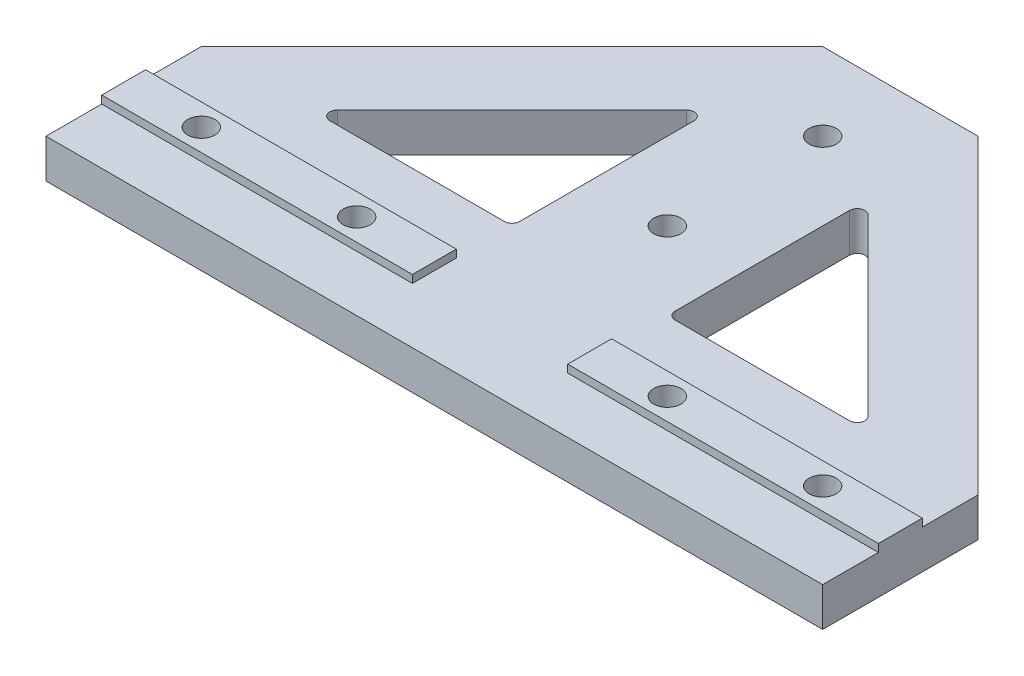
ISO-10303-21;
HEADER;
FILE_DESCRIPTION(('STEP AP214'),'2;1');
FILE_NAME('part.step','',(''),(''),'','','');
FILE_SCHEMA(('AUTOMOTIVE_DESIGN { 1 0 10303 214 1 1 1 1 }'));
ENDSEC;
DATA;
#1=APPLICATION_CONTEXT('core data for automotive mechanical design processes');
#2=APPLICATION_PROTOCOL_DEFINITION('international standard','automotive_design',2000,#1);
#3=PRODUCT_CONTEXT('',#1,'mechanical');
#4=PRODUCT('Part','Part','',(#3));
#5=PRODUCT_RELATED_PRODUCT_CATEGORY('part','',(#4));
#6=PRODUCT_DEFINITION_FORMATION('','',#4);
#7=PRODUCT_DEFINITION_CONTEXT('part definition',#1,'design');
#8=PRODUCT_DEFINITION('design','',#6,#7);
#9=PRODUCT_DEFINITION_SHAPE('','',#8);
#10=(LENGTH_UNIT() NAMED_UNIT(*) SI_UNIT(.MILLI.,.METRE.));
#11=(NAMED_UNIT(*) PLANE_ANGLE_UNIT() SI_UNIT($,.RADIAN.));
#12=(NAMED_UNIT(*) SI_UNIT($,.STERADIAN.) SOLID_ANGLE_UNIT());
#13=UNCERTAINTY_MEASURE_WITH_UNIT(LENGTH_MEASURE(1.E-05),#10,'distance_accuracy_value','');
#14=(GEOMETRIC_REPRESENTATION_CONTEXT(3) GLOBAL_UNCERTAINTY_ASSIGNED_CONTEXT((#13)) GLOBAL_UNIT_ASSIGNED_CONTEXT((#10,
#11,#12)) REPRESENTATION_CONTEXT('',''));
#15=CARTESIAN_POINT('',(0.,0.,0.));
#16=DIRECTION('',(0.,0.,1.));
#17=DIRECTION('',(1.,0.,0.));
#18=AXIS2_PLACEMENT_3D('',#15,#16,#17);
#19=CARTESIAN_POINT('',(0.,5.,0.));
#20=DIRECTION('',(0.,-1.,0.));
#21=DIRECTION('',(0.,0.,-1.));
#22=AXIS2_PLACEMENT_3D('',#19,#20,#21);
#23=PLANE('',#22);
#24=CARTESIAN_POINT('',(11.,5.,-43.4436507823299));
#25=DIRECTION('',(0.,1.,0.));
#26=DIRECTION('',(0.,0.,1.));
#27=AXIS2_PLACEMENT_3D('',#24,#25,#26);
#28=CIRCLE('',#27,1.);
#29=CARTESIAN_POINT('',(11.70710675051,5.,-44.150757594193));
#30=VERTEX_POINT('',#29);
#31=CARTESIAN_POINT('',(10.,5.,-43.4436507823299));
#32=VERTEX_POINT('',#31);
#33=EDGE_CURVE('E272',#30,#32,#28,.T.);
#34=ORIENTED_EDGE('',*,*,#33,.F.);
#35=DIRECTION('',(-0.707106811863124,0.,-0.70710675050997));
#36=VECTOR('',#35,1.);
#37=CARTESIAN_POINT('',(11.70710675051,5.,-44.150757594193));
#38=LINE('',#37,#36);
#39=CARTESIAN_POINT('',(34.1507581414754,5.,-21.7071081505837));
#40=VERTEX_POINT('',#39);
#41=EDGE_CURVE('E284',#40,#30,#38,.T.);
#42=ORIENTED_EDGE('',*,*,#41,.F.);
#43=CARTESIAN_POINT('',(33.4436513909654,5.,-21.0000013387206));
#44=DIRECTION('',(0.,1.,0.));
#45=DIRECTION('',(0.,0.,1.));
#46=AXIS2_PLACEMENT_3D('',#43,#44,#45);
#47=CIRCLE('',#46,1.);
#48=CARTESIAN_POINT('',(33.4436513909654,5.,-20.0000013387206));
#49=VERTEX_POINT('',#48);
#50=EDGE_CURVE('E281',#49,#40,#47,.T.);
#51=ORIENTED_EDGE('',*,*,#50,.F.);
#52=DIRECTION('',(1.,0.,0.));
#53=VECTOR('',#52,1.);
#54=CARTESIAN_POINT('',(33.4436513909654,5.,-20.0000013387206));
#55=LINE('',#54,#53);
#56=CARTESIAN_POINT('',(11.,5.,-20.0000013387206));
#57=VERTEX_POINT('',#56);
#58=EDGE_CURVE('E279',#57,#49,#55,.T.);
#59=ORIENTED_EDGE('',*,*,#58,.F.);
#60=CARTESIAN_POINT('',(11.,5.,-21.0000013387206));
#61=DIRECTION('',(0.,1.,0.));
#62=DIRECTION('',(0.,0.,1.));
#63=AXIS2_PLACEMENT_3D('',#60,#61,#62);
#64=CIRCLE('',#63,0.999999999999999);
#65=CARTESIAN_POINT('',(10.,5.,-21.0000013387206));
#66=VERTEX_POINT('',#65);
#67=EDGE_CURVE('E277',#66,#57,#64,.T.);
#68=ORIENTED_EDGE('',*,*,#67,.F.);
#69=DIRECTION('',(0.,0.,1.));
#70=VECTOR('',#69,1.);
#71=CARTESIAN_POINT('',(10.,5.,-43.4436507823299));
#72=LINE('',#71,#70);
#73=EDGE_CURVE('E274',#32,#66,#72,.T.);
#74=ORIENTED_EDGE('',*,*,#73,.F.);
#75=EDGE_LOOP('',(#34,#42,#51,#59,#68,#74));
#76=FACE_BOUND('',#75,.T.);
#77=CARTESIAN_POINT('',(-11.,5.,-21.0000013387206));
#78=DIRECTION('',(0.,1.,0.));
#79=DIRECTION('',(0.,0.,-1.));
#80=AXIS2_PLACEMENT_3D('',#77,#78,#79);
#81=CIRCLE('',#80,0.999999999999999);
#82=CARTESIAN_POINT('',(-11.,5.,-20.0000013387206));
#83=VERTEX_POINT('',#82);
#84=CARTESIAN_POINT('',(-10.,5.,-21.0000013387206));
#85=VERTEX_POINT('',#84);
#86=EDGE_CURVE('E341',#83,#85,#81,.T.);
#87=ORIENTED_EDGE('',*,*,#86,.F.);
#88=DIRECTION('',(1.,0.,0.));
#89=VECTOR('',#88,1.);
#90=CARTESIAN_POINT('',(-33.4436513909654,5.,-20.0000013387205));
#91=LINE('',#90,#89);
#92=CARTESIAN_POINT('',(-33.4436513909654,5.,-20.0000013387205));
#93=VERTEX_POINT('',#92);
#94=EDGE_CURVE('E353',#93,#83,#91,.T.);
#95=ORIENTED_EDGE('',*,*,#94,.F.);
#96=CARTESIAN_POINT('',(-33.4436513909654,5.,-21.0000013387205));
#97=DIRECTION('',(0.,1.,0.));
#98=DIRECTION('',(0.,0.,-1.));
#99=AXIS2_PLACEMENT_3D('',#96,#97,#98);
#100=CIRCLE('',#99,1.);
#101=CARTESIAN_POINT('',(-34.1507581414754,5.,-21.7071081505837));
#102=VERTEX_POINT('',#101);
#103=EDGE_CURVE('E350',#102,#93,#100,.T.);
#104=ORIENTED_EDGE('',*,*,#103,.F.);
#105=DIRECTION('',(-0.707106811863124,0.,0.70710675050997));
#106=VECTOR('',#105,1.);
#107=CARTESIAN_POINT('',(-11.70710675051,5.,-44.150757594193));
#108=LINE('',#107,#106);
#109=CARTESIAN_POINT('',(-11.70710675051,5.,-44.150757594193));
#110=VERTEX_POINT('',#109);
#111=EDGE_CURVE('E348',#110,#102,#108,.T.);
#112=ORIENTED_EDGE('',*,*,#111,.F.);
#113=CARTESIAN_POINT('',(-11.,5.,-43.4436507823298));
#114=DIRECTION('',(0.,1.,0.));
#115=DIRECTION('',(0.,0.,-1.));
#116=AXIS2_PLACEMENT_3D('',#113,#114,#115);
#117=CIRCLE('',#116,1.);
#118=CARTESIAN_POINT('',(-10.,5.,-43.4436507823298));
#119=VERTEX_POINT('',#118);
#120=EDGE_CURVE('E346',#119,#110,#117,.T.);
#121=ORIENTED_EDGE('',*,*,#120,.F.);
#122=DIRECTION('',(0.,0.,-1.));
#123=VECTOR('',#122,1.);
#124=CARTESIAN_POINT('',(-10.,5.,-43.4436507823298));
#125=LINE('',#124,#123);
#126=EDGE_CURVE('E343',#85,#119,#125,.T.);
#127=ORIENTED_EDGE('',*,*,#126,.F.);
#128=EDGE_LOOP('',(#87,#95,#104,#112,#121,#127));
#129=FACE_BOUND('',#128,.T.);
#130=CARTESIAN_POINT('',(0.,5.,-50.0000025455212));
#131=DIRECTION('',(0.,1.,0.));
#132=DIRECTION('',(0.,0.,1.));
#133=AXIS2_PLACEMENT_3D('',#130,#131,#132);
#134=CIRCLE('',#133,1.75);
#135=CARTESIAN_POINT('',(0.,5.,-48.2500025455212));
#136=VERTEX_POINT('',#135);
#137=EDGE_CURVE('E329',#136,#136,#134,.T.);
#138=ORIENTED_EDGE('',*,*,#137,.F.);
#139=EDGE_LOOP('',(#138));
#140=FACE_BOUND('',#139,.T.);
#141=CARTESIAN_POINT('',(0.,5.,-30.0000025455212));
#142=DIRECTION('',(0.,1.,0.));
#143=DIRECTION('',(0.,0.,1.));
#144=AXIS2_PLACEMENT_3D('',#141,#142,#143);
#145=CIRCLE('',#144,1.75);
#146=CARTESIAN_POINT('',(0.,5.,-28.2500025455212));
#147=VERTEX_POINT('',#146);
#148=EDGE_CURVE('E317',#147,#147,#145,.T.);
#149=ORIENTED_EDGE('',*,*,#148,.F.);
#150=EDGE_LOOP('',(#149));
#151=FACE_BOUND('',#150,.T.);
#152=DIRECTION('',(1.,0.,0.));
#153=VECTOR('',#152,1.);
#154=CARTESIAN_POINT('',(0.,5.,-7.17500133872055));
#155=LINE('',#154,#153);
#156=CARTESIAN_POINT('',(10.,5.,-7.17500133872055));
#157=VERTEX_POINT('',#156);
#158=CARTESIAN_POINT('',(50.,5.,-7.17500133872055));
#159=VERTEX_POINT('',#158);
#160=EDGE_CURVE('E52',#157,#159,#155,.T.);
#161=ORIENTED_EDGE('',*,*,#160,.F.);
#162=DIRECTION('',(0.,0.,1.));
#163=VECTOR('',#162,1.);
#164=CARTESIAN_POINT('',(10.,5.,0.));
#165=LINE('',#164,#163);
#166=CARTESIAN_POINT('',(10.,5.,-12.8250013387206));
#167=VERTEX_POINT('',#166);
#168=EDGE_CURVE('E57',#167,#157,#165,.T.);
#169=ORIENTED_EDGE('',*,*,#168,.F.);
#170=DIRECTION('',(1.,0.,0.));
#171=VECTOR('',#170,1.);
#172=CARTESIAN_POINT('',(0.,5.,-12.8250013387206));
#173=LINE('',#172,#171);
#174=CARTESIAN_POINT('',(50.,5.,-12.8250013387206));
#175=VERTEX_POINT('',#174);
#176=EDGE_CURVE('E449',#167,#175,#173,.T.);
#177=ORIENTED_EDGE('',*,*,#176,.T.);
#178=DIRECTION('',(0.,0.,-1.));
#179=VECTOR('',#178,1.);
#180=CARTESIAN_POINT('',(50.,5.,-20.0000026774411));
#181=LINE('',#180,#179);
#182=CARTESIAN_POINT('',(50.,5.,-20.0000026774411));
#183=VERTEX_POINT('',#182);
#184=EDGE_CURVE('E389',#175,#183,#181,.T.);
#185=ORIENTED_EDGE('',*,*,#184,.T.);
#186=DIRECTION('',(-0.707106811863124,0.,-0.70710675050997));
#187=VECTOR('',#186,1.);
#188=CARTESIAN_POINT('',(9.99999666126133,5.,-60.0000025455212));
#189=LINE('',#188,#187);
#190=CARTESIAN_POINT('',(9.99999666126133,5.,-60.0000025455212));
#191=VERTEX_POINT('',#190);
#192=EDGE_CURVE('E393',#183,#191,#189,.T.);
#193=ORIENTED_EDGE('',*,*,#192,.T.);
#194=DIRECTION('',(-1.,0.,0.));
#195=VECTOR('',#194,1.);
#196=CARTESIAN_POINT('',(-9.99999666126133,5.,-60.0000025455212));
#197=LINE('',#196,#195);
#198=CARTESIAN_POINT('',(-9.99999666126133,5.,-60.0000025455212));
#199=VERTEX_POINT('',#198);
#200=EDGE_CURVE('E395',#191,#199,#197,.T.);
#201=ORIENTED_EDGE('',*,*,#200,.T.);
#202=DIRECTION('',(-0.707106811863124,0.,0.70710675050997));
#203=VECTOR('',#202,1.);
#204=CARTESIAN_POINT('',(-9.99999666126133,5.,-60.0000025455212));
#205=LINE('',#204,#203);
#206=CARTESIAN_POINT('',(-50.,5.,-20.0000026774411));
#207=VERTEX_POINT('',#206);
#208=EDGE_CURVE('E397',#199,#207,#205,.T.);
#209=ORIENTED_EDGE('',*,*,#208,.T.);
#210=DIRECTION('',(0.,0.,1.));
#211=VECTOR('',#210,1.);
#212=CARTESIAN_POINT('',(-50.,5.,0.));
#213=LINE('',#212,#211);
#214=CARTESIAN_POINT('',(-50.,5.,-12.8250013387205));
#215=VERTEX_POINT('',#214);
#216=EDGE_CURVE('E400',#207,#215,#213,.T.);
#217=ORIENTED_EDGE('',*,*,#216,.T.);
#218=DIRECTION('',(-1.,0.,0.));
#219=VECTOR('',#218,1.);
#220=CARTESIAN_POINT('',(0.,5.,-12.8250013387205));
#221=LINE('',#220,#219);
#222=CARTESIAN_POINT('',(-9.99999999999999,5.,-12.8250013387205));
#223=VERTEX_POINT('',#222);
#224=EDGE_CURVE('E233',#223,#215,#221,.T.);
#225=ORIENTED_EDGE('',*,*,#224,.F.);
#226=DIRECTION('',(0.,0.,-1.));
#227=VECTOR('',#226,1.);
#228=CARTESIAN_POINT('',(-9.99999999999999,5.,0.));
#229=LINE('',#228,#227);
#230=CARTESIAN_POINT('',(-9.99999999999999,5.,-7.17500133872054));
#231=VERTEX_POINT('',#230);
#232=EDGE_CURVE('E230',#231,#223,#229,.T.);
#233=ORIENTED_EDGE('',*,*,#232,.F.);
#234=DIRECTION('',(-1.,0.,0.));
#235=VECTOR('',#234,1.);
#236=CARTESIAN_POINT('',(0.,5.,-7.17500133872054));
#237=LINE('',#236,#235);
#238=CARTESIAN_POINT('',(-50.,5.,-7.17500133872054));
#239=VERTEX_POINT('',#238);
#240=EDGE_CURVE('E243',#231,#239,#237,.T.);
#241=ORIENTED_EDGE('',*,*,#240,.T.);
#242=CARTESIAN_POINT('',(-50.,5.,0.));
#243=VERTEX_POINT('',#242);
#244=EDGE_CURVE('E399',#239,#243,#213,.T.);
#245=ORIENTED_EDGE('',*,*,#244,.T.);
#246=DIRECTION('',(1.,0.,0.));
#247=VECTOR('',#246,1.);
#248=CARTESIAN_POINT('',(50.,5.,0.));
#249=LINE('',#248,#247);
#250=CARTESIAN_POINT('',(50.,5.,0.));
#251=VERTEX_POINT('',#250);
#252=EDGE_CURVE('E386',#243,#251,#249,.T.);
#253=ORIENTED_EDGE('',*,*,#252,.T.);
#254=EDGE_CURVE('E391',#251,#159,#181,.T.);
#255=ORIENTED_EDGE('',*,*,#254,.T.);
#256=EDGE_LOOP('',(#161,#169,#177,#185,#193,#201,#209,#217,#225,#233,#241,#245,#253,#255));
#257=FACE_BOUND('',#256,.T.);
#258=ADVANCED_FACE('F37',(#76,#129,#140,#151,#257),#23,.F.);
#259=CARTESIAN_POINT('',(0.,0.,0.));
#260=DIRECTION('',(0.,-1.,0.));
#261=DIRECTION('',(0.,0.,-1.));
#262=AXIS2_PLACEMENT_3D('',#259,#260,#261);
#263=PLANE('',#262);
#264=CARTESIAN_POINT('',(40.,0.,-10.0000013387206));
#265=DIRECTION('',(0.,1.,0.));
#266=DIRECTION('',(0.,0.,-1.));
#267=AXIS2_PLACEMENT_3D('',#264,#265,#266);
#268=CIRCLE('',#267,1.75);
#269=CARTESIAN_POINT('',(40.,0.,-11.7500013387206));
#270=VERTEX_POINT('',#269);
#271=EDGE_CURVE('E320',#270,#270,#268,.T.);
#272=ORIENTED_EDGE('',*,*,#271,.T.);
#273=EDGE_LOOP('',(#272));
#274=FACE_BOUND('',#273,.T.);
#275=CARTESIAN_POINT('',(0.,0.,-50.0000025455212));
#276=DIRECTION('',(0.,1.,0.));
#277=DIRECTION('',(0.,0.,1.));
#278=AXIS2_PLACEMENT_3D('',#275,#276,#277);
#279=CIRCLE('',#278,1.75);
#280=CARTESIAN_POINT('',(0.,0.,-48.2500025455212));
#281=VERTEX_POINT('',#280);
#282=EDGE_CURVE('E328',#281,#281,#279,.T.);
#283=ORIENTED_EDGE('',*,*,#282,.T.);
#284=EDGE_LOOP('',(#283));
#285=FACE_BOUND('',#284,.T.);
#286=CARTESIAN_POINT('',(-40.,0.,-10.0000013387205));
#287=DIRECTION('',(0.,1.,0.));
#288=DIRECTION('',(0.,0.,1.));
#289=AXIS2_PLACEMENT_3D('',#286,#287,#288);
#290=CIRCLE('',#289,1.75);
#291=CARTESIAN_POINT('',(-40.,0.,-8.25000133872054));
#292=VERTEX_POINT('',#291);
#293=EDGE_CURVE('E337',#292,#292,#290,.T.);
#294=ORIENTED_EDGE('',*,*,#293,.T.);
#295=EDGE_LOOP('',(#294));
#296=FACE_BOUND('',#295,.T.);
#297=DIRECTION('',(1.,0.,0.));
#298=VECTOR('',#297,1.);
#299=CARTESIAN_POINT('',(50.,0.,0.));
#300=LINE('',#299,#298);
#301=CARTESIAN_POINT('',(-50.,0.,0.));
#302=VERTEX_POINT('',#301);
#303=CARTESIAN_POINT('',(50.,0.,0.));
#304=VERTEX_POINT('',#303);
#305=EDGE_CURVE('E385',#302,#304,#300,.T.);
#306=ORIENTED_EDGE('',*,*,#305,.F.);
#307=DIRECTION('',(0.,0.,1.));
#308=VECTOR('',#307,1.);
#309=CARTESIAN_POINT('',(-50.,0.,0.));
#310=LINE('',#309,#308);
#311=CARTESIAN_POINT('',(-50.,0.,-20.0000026774411));
#312=VERTEX_POINT('',#311);
#313=EDGE_CURVE('E390',#312,#302,#310,.T.);
#314=ORIENTED_EDGE('',*,*,#313,.F.);
#315=DIRECTION('',(-0.707106811863124,0.,0.70710675050997));
#316=VECTOR('',#315,1.);
#317=CARTESIAN_POINT('',(-9.99999666126133,0.,-60.0000025455212));
#318=LINE('',#317,#316);
#319=CARTESIAN_POINT('',(-9.99999666126133,0.,-60.0000025455212));
#320=VERTEX_POINT('',#319);
#321=EDGE_CURVE('E411',#320,#312,#318,.T.);
#322=ORIENTED_EDGE('',*,*,#321,.F.);
#323=DIRECTION('',(-1.,0.,0.));
#324=VECTOR('',#323,1.);
#325=CARTESIAN_POINT('',(-9.99999666126133,0.,-60.0000025455212));
#326=LINE('',#325,#324);
#327=CARTESIAN_POINT('',(9.99999666126133,0.,-60.0000025455212));
#328=VERTEX_POINT('',#327);
#329=EDGE_CURVE('E409',#328,#320,#326,.T.);
#330=ORIENTED_EDGE('',*,*,#329,.F.);
#331=DIRECTION('',(-0.707106811863124,0.,-0.70710675050997));
#332=VECTOR('',#331,1.);
#333=CARTESIAN_POINT('',(9.99999666126133,0.,-60.0000025455212));
#334=LINE('',#333,#332);
#335=CARTESIAN_POINT('',(50.,0.,-20.0000026774411));
#336=VERTEX_POINT('',#335);
#337=EDGE_CURVE('E407',#336,#328,#334,.T.);
#338=ORIENTED_EDGE('',*,*,#337,.F.);
#339=DIRECTION('',(0.,0.,-1.));
#340=VECTOR('',#339,1.);
#341=CARTESIAN_POINT('',(50.,0.,-20.0000026774411));
#342=LINE('',#341,#340);
#343=EDGE_CURVE('E405',#304,#336,#342,.T.);
#344=ORIENTED_EDGE('',*,*,#343,.F.);
#345=EDGE_LOOP('',(#306,#314,#322,#330,#338,#344));
#346=FACE_BOUND('',#345,.T.);
#347=DIRECTION('',(1.,0.,0.));
#348=VECTOR('',#347,1.);
#349=CARTESIAN_POINT('',(-33.4436513909654,0.,-20.0000013387205));
#350=LINE('',#349,#348);
#351=CARTESIAN_POINT('',(-33.4436513909654,0.,-20.0000013387205));
#352=VERTEX_POINT('',#351);
#353=CARTESIAN_POINT('',(-11.,0.,-20.0000013387206));
#354=VERTEX_POINT('',#353);
#355=EDGE_CURVE('E344',#352,#354,#350,.T.);
#356=ORIENTED_EDGE('',*,*,#355,.T.);
#357=CARTESIAN_POINT('',(-11.,0.,-21.0000013387206));
#358=DIRECTION('',(0.,1.,0.));
#359=DIRECTION('',(0.,0.,-1.));
#360=AXIS2_PLACEMENT_3D('',#357,#358,#359);
#361=CIRCLE('',#360,0.999999999999999);
#362=CARTESIAN_POINT('',(-10.,0.,-21.0000013387206));
#363=VERTEX_POINT('',#362);
#364=EDGE_CURVE('E340',#354,#363,#361,.T.);
#365=ORIENTED_EDGE('',*,*,#364,.T.);
#366=DIRECTION('',(0.,0.,-1.));
#367=VECTOR('',#366,1.);
#368=CARTESIAN_POINT('',(-10.,0.,-43.4436507823298));
#369=LINE('',#368,#367);
#370=CARTESIAN_POINT('',(-10.,0.,-43.4436507823298));
#371=VERTEX_POINT('',#370);
#372=EDGE_CURVE('E358',#363,#371,#369,.T.);
#373=ORIENTED_EDGE('',*,*,#372,.T.);
#374=CARTESIAN_POINT('',(-11.,0.,-43.4436507823298));
#375=DIRECTION('',(0.,1.,0.));
#376=DIRECTION('',(0.,0.,-1.));
#377=AXIS2_PLACEMENT_3D('',#374,#375,#376);
#378=CIRCLE('',#377,1.);
#379=CARTESIAN_POINT('',(-11.70710675051,0.,-44.150757594193));
#380=VERTEX_POINT('',#379);
#381=EDGE_CURVE('E361',#371,#380,#378,.T.);
#382=ORIENTED_EDGE('',*,*,#381,.T.);
#383=DIRECTION('',(-0.707106811863124,0.,0.70710675050997));
#384=VECTOR('',#383,1.);
#385=CARTESIAN_POINT('',(-11.70710675051,0.,-44.150757594193));
#386=LINE('',#385,#384);
#387=CARTESIAN_POINT('',(-34.1507581414754,0.,-21.7071081505837));
#388=VERTEX_POINT('',#387);
#389=EDGE_CURVE('E364',#380,#388,#386,.T.);
#390=ORIENTED_EDGE('',*,*,#389,.T.);
#391=CARTESIAN_POINT('',(-33.4436513909654,0.,-21.0000013387205));
#392=DIRECTION('',(0.,1.,0.));
#393=DIRECTION('',(0.,0.,-1.));
#394=AXIS2_PLACEMENT_3D('',#391,#392,#393);
#395=CIRCLE('',#394,1.);
#396=EDGE_CURVE('E367',#388,#352,#395,.T.);
#397=ORIENTED_EDGE('',*,*,#396,.T.);
#398=EDGE_LOOP('',(#356,#365,#373,#382,#390,#397));
#399=FACE_BOUND('',#398,.T.);
#400=CARTESIAN_POINT('',(-20.,0.,-10.0000013387205));
#401=DIRECTION('',(0.,1.,0.));
#402=DIRECTION('',(0.,0.,1.));
#403=AXIS2_PLACEMENT_3D('',#400,#401,#402);
#404=CIRCLE('',#403,1.75);
#405=CARTESIAN_POINT('',(-20.,0.,-8.25000133872054));
#406=VERTEX_POINT('',#405);
#407=EDGE_CURVE('E332',#406,#406,#404,.T.);
#408=ORIENTED_EDGE('',*,*,#407,.T.);
#409=EDGE_LOOP('',(#408));
#410=FACE_BOUND('',#409,.T.);
#411=CARTESIAN_POINT('',(20.,0.,-10.0000013387206));
#412=DIRECTION('',(0.,1.,0.));
#413=DIRECTION('',(0.,0.,-1.));
#414=AXIS2_PLACEMENT_3D('',#411,#412,#413);
#415=CIRCLE('',#414,1.75);
#416=CARTESIAN_POINT('',(20.,0.,-11.7500013387206));
#417=VERTEX_POINT('',#416);
#418=EDGE_CURVE('E325',#417,#417,#415,.T.);
#419=ORIENTED_EDGE('',*,*,#418,.T.);
#420=EDGE_LOOP('',(#419));
#421=FACE_BOUND('',#420,.T.);
#422=CARTESIAN_POINT('',(0.,0.,-30.0000025455212));
#423=DIRECTION('',(0.,1.,0.));
#424=DIRECTION('',(0.,0.,1.));
#425=AXIS2_PLACEMENT_3D('',#422,#423,#424);
#426=CIRCLE('',#425,1.75);
#427=CARTESIAN_POINT('',(0.,0.,-28.2500025455212));
#428=VERTEX_POINT('',#427);
#429=EDGE_CURVE('E316',#428,#428,#426,.T.);
#430=ORIENTED_EDGE('',*,*,#429,.T.);
#431=EDGE_LOOP('',(#430));
#432=FACE_BOUND('',#431,.T.);
#433=DIRECTION('',(-0.707106811863124,0.,-0.70710675050997));
#434=VECTOR('',#433,1.);
#435=CARTESIAN_POINT('',(11.70710675051,0.,-44.150757594193));
#436=LINE('',#435,#434);
#437=CARTESIAN_POINT('',(34.1507581414754,0.,-21.7071081505837));
#438=VERTEX_POINT('',#437);
#439=CARTESIAN_POINT('',(11.70710675051,0.,-44.150757594193));
#440=VERTEX_POINT('',#439);
#441=EDGE_CURVE('E275',#438,#440,#436,.T.);
#442=ORIENTED_EDGE('',*,*,#441,.T.);
#443=CARTESIAN_POINT('',(11.,0.,-43.4436507823299));
#444=DIRECTION('',(0.,1.,0.));
#445=DIRECTION('',(0.,0.,1.));
#446=AXIS2_PLACEMENT_3D('',#443,#444,#445);
#447=CIRCLE('',#446,1.);
#448=CARTESIAN_POINT('',(10.,0.,-43.4436507823299));
#449=VERTEX_POINT('',#448);
#450=EDGE_CURVE('E271',#440,#449,#447,.T.);
#451=ORIENTED_EDGE('',*,*,#450,.T.);
#452=DIRECTION('',(0.,0.,1.));
#453=VECTOR('',#452,1.);
#454=CARTESIAN_POINT('',(10.,0.,-43.4436507823299));
#455=LINE('',#454,#453);
#456=CARTESIAN_POINT('',(10.,0.,-21.0000013387206));
#457=VERTEX_POINT('',#456);
#458=EDGE_CURVE('E289',#449,#457,#455,.T.);
#459=ORIENTED_EDGE('',*,*,#458,.T.);
#460=CARTESIAN_POINT('',(11.,0.,-21.0000013387206));
#461=DIRECTION('',(0.,1.,0.));
#462=DIRECTION('',(0.,0.,1.));
#463=AXIS2_PLACEMENT_3D('',#460,#461,#462);
#464=CIRCLE('',#463,0.999999999999999);
#465=CARTESIAN_POINT('',(11.,0.,-20.0000013387206));
#466=VERTEX_POINT('',#465);
#467=EDGE_CURVE('E292',#457,#466,#464,.T.);
#468=ORIENTED_EDGE('',*,*,#467,.T.);
#469=DIRECTION('',(1.,0.,0.));
#470=VECTOR('',#469,1.);
#471=CARTESIAN_POINT('',(33.4436513909654,0.,-20.0000013387206));
#472=LINE('',#471,#470);
#473=CARTESIAN_POINT('',(33.4436513909654,0.,-20.0000013387206));
#474=VERTEX_POINT('',#473);
#475=EDGE_CURVE('E295',#466,#474,#472,.T.);
#476=ORIENTED_EDGE('',*,*,#475,.T.);
#477=CARTESIAN_POINT('',(33.4436513909654,0.,-21.0000013387206));
#478=DIRECTION('',(0.,1.,0.));
#479=DIRECTION('',(0.,0.,1.));
#480=AXIS2_PLACEMENT_3D('',#477,#478,#479);
#481=CIRCLE('',#480,1.);
#482=EDGE_CURVE('E298',#474,#438,#481,.T.);
#483=ORIENTED_EDGE('',*,*,#482,.T.);
#484=EDGE_LOOP('',(#442,#451,#459,#468,#476,#483));
#485=FACE_BOUND('',#484,.T.);
#486=ADVANCED_FACE('F435',(#274,#285,#296,#346,#399,#410,#421,#432,#485),#263,.T.);
#487=CARTESIAN_POINT('',(50.,5.,0.));
#488=DIRECTION('',(0.,0.,-1.));
#489=DIRECTION('',(-1.,0.,0.));
#490=AXIS2_PLACEMENT_3D('',#487,#488,#489);
#491=PLANE('',#490);
#492=ORIENTED_EDGE('',*,*,#305,.T.);
#493=DIRECTION('',(0.,-1.,0.));
#494=VECTOR('',#493,1.);
#495=CARTESIAN_POINT('',(50.,5.,0.));
#496=LINE('',#495,#494);
#497=EDGE_CURVE('E11',#251,#304,#496,.T.);
#498=ORIENTED_EDGE('',*,*,#497,.F.);
#499=ORIENTED_EDGE('',*,*,#252,.F.);
#500=DIRECTION('',(0.,-1.,0.));
#501=VECTOR('',#500,1.);
#502=CARTESIAN_POINT('',(-50.,5.,0.));
#503=LINE('',#502,#501);
#504=EDGE_CURVE('E402',#243,#302,#503,.T.);
#505=ORIENTED_EDGE('',*,*,#504,.T.);
#506=EDGE_LOOP('',(#492,#498,#499,#505));
#507=FACE_BOUND('',#506,.T.);
#508=ADVANCED_FACE('F39',(#507),#491,.F.);
#509=CARTESIAN_POINT('',(50.,5.,-20.0000026774411));
#510=DIRECTION('',(-1.,0.,0.));
#511=DIRECTION('',(0.,0.,1.));
#512=AXIS2_PLACEMENT_3D('',#509,#510,#511);
#513=PLANE('',#512);
#514=ORIENTED_EDGE('',*,*,#343,.T.);
#515=DIRECTION('',(0.,-1.,0.));
#516=VECTOR('',#515,1.);
#517=CARTESIAN_POINT('',(50.,5.,-20.0000026774411));
#518=LINE('',#517,#516);
#519=EDGE_CURVE('E45',#183,#336,#518,.T.);
#520=ORIENTED_EDGE('',*,*,#519,.F.);
#521=ORIENTED_EDGE('',*,*,#184,.F.);
#522=DIRECTION('',(0.,-1.,0.));
#523=VECTOR('',#522,1.);
#524=CARTESIAN_POINT('',(50.,6.,-12.8250013387206));
#525=LINE('',#524,#523);
#526=CARTESIAN_POINT('',(50.,6.,-12.8250013387206));
#527=VERTEX_POINT('',#526);
#528=EDGE_CURVE('E235',#527,#175,#525,.T.);
#529=ORIENTED_EDGE('',*,*,#528,.F.);
#530=DIRECTION('',(0.,0.,-1.));
#531=VECTOR('',#530,1.);
#532=CARTESIAN_POINT('',(50.,6.,0.));
#533=LINE('',#532,#531);
#534=CARTESIAN_POINT('',(50.,6.,-7.17500133872056));
#535=VERTEX_POINT('',#534);
#536=EDGE_CURVE('E218',#535,#527,#533,.T.);
#537=ORIENTED_EDGE('',*,*,#536,.F.);
#538=DIRECTION('',(0.,-1.,0.));
#539=VECTOR('',#538,1.);
#540=CARTESIAN_POINT('',(50.,6.,-7.17500133872056));
#541=LINE('',#540,#539);
#542=EDGE_CURVE('E215',#535,#159,#541,.T.);
#543=ORIENTED_EDGE('',*,*,#542,.T.);
#544=ORIENTED_EDGE('',*,*,#254,.F.);
#545=ORIENTED_EDGE('',*,*,#497,.T.);
#546=EDGE_LOOP('',(#514,#520,#521,#529,#537,#543,#544,#545));
#547=FACE_BOUND('',#546,.T.);
#548=ADVANCED_FACE('F452',(#547),#513,.F.);
#549=CARTESIAN_POINT('',(9.99999666126133,5.,-60.0000025455212));
#550=DIRECTION('',(-0.70710675050997,0.,0.707106811863124));
#551=DIRECTION('',(0.707106811863123,0.,0.70710675050997));
#552=AXIS2_PLACEMENT_3D('',#549,#550,#551);
#553=PLANE('',#552);
#554=ORIENTED_EDGE('',*,*,#337,.T.);
#555=DIRECTION('',(0.,-1.,0.));
#556=VECTOR('',#555,1.);
#557=CARTESIAN_POINT('',(9.99999666126133,5.,-60.0000025455212));
#558=LINE('',#557,#556);
#559=EDGE_CURVE('E422',#191,#328,#558,.T.);
#560=ORIENTED_EDGE('',*,*,#559,.F.);
#561=ORIENTED_EDGE('',*,*,#192,.F.);
#562=ORIENTED_EDGE('',*,*,#519,.T.);
#563=EDGE_LOOP('',(#554,#560,#561,#562));
#564=FACE_BOUND('',#563,.T.);
#565=ADVANCED_FACE('F429',(#564),#553,.F.);
#566=CARTESIAN_POINT('',(-9.99999666126133,5.,-60.0000025455212));
#567=DIRECTION('',(0.,0.,1.));
#568=DIRECTION('',(1.,0.,0.));
#569=AXIS2_PLACEMENT_3D('',#566,#567,#568);
#570=PLANE('',#569);
#571=ORIENTED_EDGE('',*,*,#329,.T.);
#572=DIRECTION('',(0.,-1.,0.));
#573=VECTOR('',#572,1.);
#574=CARTESIAN_POINT('',(-9.99999666126133,5.,-60.0000025455212));
#575=LINE('',#574,#573);
#576=EDGE_CURVE('E419',#199,#320,#575,.T.);
#577=ORIENTED_EDGE('',*,*,#576,.F.);
#578=ORIENTED_EDGE('',*,*,#200,.F.);
#579=ORIENTED_EDGE('',*,*,#559,.T.);
#580=EDGE_LOOP('',(#571,#577,#578,#579));
#581=FACE_BOUND('',#580,.T.);
#582=ADVANCED_FACE('F441',(#581),#570,.F.);
#583=CARTESIAN_POINT('',(-9.99999666126133,5.,-60.0000025455212));
#584=DIRECTION('',(0.70710675050997,0.,0.707106811863124));
#585=DIRECTION('',(0.707106811863123,0.,-0.70710675050997));
#586=AXIS2_PLACEMENT_3D('',#583,#584,#585);
#587=PLANE('',#586);
#588=ORIENTED_EDGE('',*,*,#321,.T.);
#589=DIRECTION('',(0.,-1.,0.));
#590=VECTOR('',#589,1.);
#591=CARTESIAN_POINT('',(-50.,5.,-20.0000026774411));
#592=LINE('',#591,#590);
#593=EDGE_CURVE('E416',#207,#312,#592,.T.);
#594=ORIENTED_EDGE('',*,*,#593,.F.);
#595=ORIENTED_EDGE('',*,*,#208,.F.);
#596=ORIENTED_EDGE('',*,*,#576,.T.);
#597=EDGE_LOOP('',(#588,#594,#595,#596));
#598=FACE_BOUND('',#597,.T.);
#599=ADVANCED_FACE('F445',(#598),#587,.F.);
#600=CARTESIAN_POINT('',(-50.,5.,0.));
#601=DIRECTION('',(1.,0.,0.));
#602=DIRECTION('',(0.,0.,-1.));
#603=AXIS2_PLACEMENT_3D('',#600,#601,#602);
#604=PLANE('',#603);
#605=ORIENTED_EDGE('',*,*,#313,.T.);
#606=ORIENTED_EDGE('',*,*,#504,.F.);
#607=ORIENTED_EDGE('',*,*,#244,.F.);
#608=DIRECTION('',(0.,-1.,0.));
#609=VECTOR('',#608,1.);
#610=CARTESIAN_POINT('',(-50.,6.,-7.17500133872054));
#611=LINE('',#610,#609);
#612=CARTESIAN_POINT('',(-50.,6.,-7.17500133872054));
#613=VERTEX_POINT('',#612);
#614=EDGE_CURVE('E262',#613,#239,#611,.T.);
#615=ORIENTED_EDGE('',*,*,#614,.F.);
#616=DIRECTION('',(0.,0.,1.));
#617=VECTOR('',#616,1.);
#618=CARTESIAN_POINT('',(-50.,6.,0.));
#619=LINE('',#618,#617);
#620=CARTESIAN_POINT('',(-50.,6.,-12.8250013387205));
#621=VERTEX_POINT('',#620);
#622=EDGE_CURVE('E251',#621,#613,#619,.T.);
#623=ORIENTED_EDGE('',*,*,#622,.F.);
#624=DIRECTION('',(0.,-1.,0.));
#625=VECTOR('',#624,1.);
#626=CARTESIAN_POINT('',(-50.,6.,-12.8250013387205));
#627=LINE('',#626,#625);
#628=EDGE_CURVE('E265',#621,#215,#627,.T.);
#629=ORIENTED_EDGE('',*,*,#628,.T.);
#630=ORIENTED_EDGE('',*,*,#216,.F.);
#631=ORIENTED_EDGE('',*,*,#593,.T.);
#632=EDGE_LOOP('',(#605,#606,#607,#615,#623,#629,#630,#631));
#633=FACE_BOUND('',#632,.T.);
#634=ADVANCED_FACE('F503',(#633),#604,.F.);
#635=CARTESIAN_POINT('',(-11.,5.,-21.0000013387206));
#636=DIRECTION('',(0.,-1.,0.));
#637=DIRECTION('',(0.,0.,-1.));
#638=AXIS2_PLACEMENT_3D('',#635,#636,#637);
#639=CYLINDRICAL_SURFACE('',#638,0.999999999999999);
#640=ORIENTED_EDGE('',*,*,#364,.F.);
#641=DIRECTION('',(0.,-1.,0.));
#642=VECTOR('',#641,1.);
#643=CARTESIAN_POINT('',(-11.,5.,-20.0000013387206));
#644=LINE('',#643,#642);
#645=EDGE_CURVE('E355',#83,#354,#644,.T.);
#646=ORIENTED_EDGE('',*,*,#645,.F.);
#647=ORIENTED_EDGE('',*,*,#86,.T.);
#648=DIRECTION('',(0.,-1.,0.));
#649=VECTOR('',#648,1.);
#650=CARTESIAN_POINT('',(-10.,5.,-21.0000013387206));
#651=LINE('',#650,#649);
#652=EDGE_CURVE('E382',#85,#363,#651,.T.);
#653=ORIENTED_EDGE('',*,*,#652,.T.);
#654=EDGE_LOOP('',(#640,#646,#647,#653));
#655=FACE_BOUND('',#654,.T.);
#656=ADVANCED_FACE('F500',(#655),#639,.F.);
#657=CARTESIAN_POINT('',(-10.,5.,-43.4436507823298));
#658=DIRECTION('',(-1.,0.,0.));
#659=DIRECTION('',(0.,0.,1.));
#660=AXIS2_PLACEMENT_3D('',#657,#658,#659);
#661=PLANE('',#660);
#662=ORIENTED_EDGE('',*,*,#372,.F.);
#663=ORIENTED_EDGE('',*,*,#652,.F.);
#664=ORIENTED_EDGE('',*,*,#126,.T.);
#665=DIRECTION('',(0.,-1.,0.));
#666=VECTOR('',#665,1.);
#667=CARTESIAN_POINT('',(-10.,5.,-43.4436507823298));
#668=LINE('',#667,#666);
#669=EDGE_CURVE('E380',#119,#371,#668,.T.);
#670=ORIENTED_EDGE('',*,*,#669,.T.);
#671=EDGE_LOOP('',(#662,#663,#664,#670));
#672=FACE_BOUND('',#671,.T.);
#673=ADVANCED_FACE('F776',(#672),#661,.T.);
#674=CARTESIAN_POINT('',(-11.,5.,-43.4436507823298));
#675=DIRECTION('',(0.,-1.,0.));
#676=DIRECTION('',(0.,0.,-1.));
#677=AXIS2_PLACEMENT_3D('',#674,#675,#676);
#678=CYLINDRICAL_SURFACE('',#677,1.);
#679=ORIENTED_EDGE('',*,*,#381,.F.);
#680=ORIENTED_EDGE('',*,*,#669,.F.);
#681=ORIENTED_EDGE('',*,*,#120,.T.);
#682=DIRECTION('',(0.,-1.,0.));
#683=VECTOR('',#682,1.);
#684=CARTESIAN_POINT('',(-11.70710675051,5.,-44.150757594193));
#685=LINE('',#684,#683);
#686=EDGE_CURVE('E378',#110,#380,#685,.T.);
#687=ORIENTED_EDGE('',*,*,#686,.T.);
#688=EDGE_LOOP('',(#679,#680,#681,#687));
#689=FACE_BOUND('',#688,.T.);
#690=ADVANCED_FACE('F784',(#689),#678,.F.);
#691=CARTESIAN_POINT('',(-11.70710675051,5.,-44.150757594193));
#692=DIRECTION('',(0.70710675050997,0.,0.707106811863124));
#693=DIRECTION('',(0.707106811863124,0.,-0.70710675050997));
#694=AXIS2_PLACEMENT_3D('',#691,#692,#693);
#695=PLANE('',#694);
#696=ORIENTED_EDGE('',*,*,#389,.F.);
#697=ORIENTED_EDGE('',*,*,#686,.F.);
#698=ORIENTED_EDGE('',*,*,#111,.T.);
#699=DIRECTION('',(0.,-1.,0.));
#700=VECTOR('',#699,1.);
#701=CARTESIAN_POINT('',(-34.1507581414754,5.,-21.7071081505837));
#702=LINE('',#701,#700);
#703=EDGE_CURVE('E376',#102,#388,#702,.T.);
#704=ORIENTED_EDGE('',*,*,#703,.T.);
#705=EDGE_LOOP('',(#696,#697,#698,#704));
#706=FACE_BOUND('',#705,.T.);
#707=ADVANCED_FACE('F792',(#706),#695,.T.);
#708=CARTESIAN_POINT('',(-33.4436513909654,5.,-21.0000013387205));
#709=DIRECTION('',(0.,-1.,0.));
#710=DIRECTION('',(0.,0.,-1.));
#711=AXIS2_PLACEMENT_3D('',#708,#709,#710);
#712=CYLINDRICAL_SURFACE('',#711,1.);
#713=ORIENTED_EDGE('',*,*,#396,.F.);
#714=ORIENTED_EDGE('',*,*,#703,.F.);
#715=ORIENTED_EDGE('',*,*,#103,.T.);
#716=DIRECTION('',(0.,-1.,0.));
#717=VECTOR('',#716,1.);
#718=CARTESIAN_POINT('',(-33.4436513909654,5.,-20.0000013387205));
#719=LINE('',#718,#717);
#720=EDGE_CURVE('E374',#93,#352,#719,.T.);
#721=ORIENTED_EDGE('',*,*,#720,.T.);
#722=EDGE_LOOP('',(#713,#714,#715,#721));
#723=FACE_BOUND('',#722,.T.);
#724=ADVANCED_FACE('F801',(#723),#712,.F.);
#725=CARTESIAN_POINT('',(-33.4436513909654,5.,-20.0000013387205));
#726=DIRECTION('',(0.,0.,-1.));
#727=DIRECTION('',(-1.,0.,0.));
#728=AXIS2_PLACEMENT_3D('',#725,#726,#727);
#729=PLANE('',#728);
#730=ORIENTED_EDGE('',*,*,#355,.F.);
#731=ORIENTED_EDGE('',*,*,#720,.F.);
#732=ORIENTED_EDGE('',*,*,#94,.T.);
#733=ORIENTED_EDGE('',*,*,#645,.T.);
#734=EDGE_LOOP('',(#730,#731,#732,#733));
#735=FACE_BOUND('',#734,.T.);
#736=ADVANCED_FACE('F717',(#735),#729,.T.);
#737=CARTESIAN_POINT('',(-40.,5.,-10.0000013387205));
#738=DIRECTION('',(0.,-1.,0.));
#739=DIRECTION('',(0.,0.,-1.));
#740=AXIS2_PLACEMENT_3D('',#737,#738,#739);
#741=CYLINDRICAL_SURFACE('',#740,1.75);
#742=ORIENTED_EDGE('',*,*,#293,.F.);
#743=EDGE_LOOP('',(#742));
#744=FACE_BOUND('',#743,.T.);
#745=CARTESIAN_POINT('',(-40.,6.,-10.0000013387205));
#746=DIRECTION('',(0.,1.,0.));
#747=DIRECTION('',(0.,0.,1.));
#748=AXIS2_PLACEMENT_3D('',#745,#746,#747);
#749=CIRCLE('',#748,1.75);
#750=CARTESIAN_POINT('',(-40.,6.,-8.25000133872054));
#751=VERTEX_POINT('',#750);
#752=EDGE_CURVE('E242',#751,#751,#749,.F.);
#753=ORIENTED_EDGE('',*,*,#752,.F.);
#754=EDGE_LOOP('',(#753));
#755=FACE_BOUND('',#754,.T.);
#756=ADVANCED_FACE('F705',(#744,#755),#741,.F.);
#757=CARTESIAN_POINT('',(-20.,5.,-10.0000013387205));
#758=DIRECTION('',(0.,-1.,0.));
#759=DIRECTION('',(0.,0.,-1.));
#760=AXIS2_PLACEMENT_3D('',#757,#758,#759);
#761=CYLINDRICAL_SURFACE('',#760,1.75);
#762=ORIENTED_EDGE('',*,*,#407,.F.);
#763=EDGE_LOOP('',(#762));
#764=FACE_BOUND('',#763,.T.);
#765=CARTESIAN_POINT('',(-20.,6.,-10.0000013387205));
#766=DIRECTION('',(0.,1.,0.));
#767=DIRECTION('',(0.,0.,1.));
#768=AXIS2_PLACEMENT_3D('',#765,#766,#767);
#769=CIRCLE('',#768,1.75);
#770=CARTESIAN_POINT('',(-20.,6.,-8.25000133872054));
#771=VERTEX_POINT('',#770);
#772=EDGE_CURVE('E239',#771,#771,#769,.F.);
#773=ORIENTED_EDGE('',*,*,#772,.F.);
#774=EDGE_LOOP('',(#773));
#775=FACE_BOUND('',#774,.T.);
#776=ADVANCED_FACE('F699',(#764,#775),#761,.F.);
#777=CARTESIAN_POINT('',(0.,5.,-50.0000025455212));
#778=DIRECTION('',(0.,-1.,0.));
#779=DIRECTION('',(0.,0.,-1.));
#780=AXIS2_PLACEMENT_3D('',#777,#778,#779);
#781=CYLINDRICAL_SURFACE('',#780,1.75);
#782=ORIENTED_EDGE('',*,*,#137,.T.);
#783=EDGE_LOOP('',(#782));
#784=FACE_BOUND('',#783,.T.);
#785=ORIENTED_EDGE('',*,*,#282,.F.);
#786=EDGE_LOOP('',(#785));
#787=FACE_BOUND('',#786,.T.);
#788=ADVANCED_FACE('F485',(#784,#787),#781,.F.);
#789=CARTESIAN_POINT('',(20.,5.,-10.0000013387206));
#790=DIRECTION('',(0.,-1.,0.));
#791=DIRECTION('',(0.,0.,-1.));
#792=AXIS2_PLACEMENT_3D('',#789,#790,#791);
#793=CYLINDRICAL_SURFACE('',#792,1.75);
#794=ORIENTED_EDGE('',*,*,#418,.F.);
#795=EDGE_LOOP('',(#794));
#796=FACE_BOUND('',#795,.T.);
#797=CARTESIAN_POINT('',(20.,6.,-10.0000013387206));
#798=DIRECTION('',(0.,1.,0.));
#799=DIRECTION('',(0.,0.,1.));
#800=AXIS2_PLACEMENT_3D('',#797,#798,#799);
#801=CIRCLE('',#800,1.75);
#802=CARTESIAN_POINT('',(20.,6.,-8.25000133872057));
#803=VERTEX_POINT('',#802);
#804=EDGE_CURVE('E462',#803,#803,#801,.F.);
#805=ORIENTED_EDGE('',*,*,#804,.F.);
#806=EDGE_LOOP('',(#805));
#807=FACE_BOUND('',#806,.T.);
#808=ADVANCED_FACE('F475',(#796,#807),#793,.F.);
#809=CARTESIAN_POINT('',(40.,5.,-10.0000013387206));
#810=DIRECTION('',(0.,-1.,0.));
#811=DIRECTION('',(0.,0.,-1.));
#812=AXIS2_PLACEMENT_3D('',#809,#810,#811);
#813=CYLINDRICAL_SURFACE('',#812,1.75);
#814=ORIENTED_EDGE('',*,*,#271,.F.);
#815=EDGE_LOOP('',(#814));
#816=FACE_BOUND('',#815,.T.);
#817=CARTESIAN_POINT('',(40.,6.,-10.0000013387206));
#818=DIRECTION('',(0.,1.,0.));
#819=DIRECTION('',(0.,0.,1.));
#820=AXIS2_PLACEMENT_3D('',#817,#818,#819);
#821=CIRCLE('',#820,1.75);
#822=CARTESIAN_POINT('',(40.,6.,-8.25000133872057));
#823=VERTEX_POINT('',#822);
#824=EDGE_CURVE('E227',#823,#823,#821,.F.);
#825=ORIENTED_EDGE('',*,*,#824,.F.);
#826=EDGE_LOOP('',(#825));
#827=FACE_BOUND('',#826,.T.);
#828=ADVANCED_FACE('F472',(#816,#827),#813,.F.);
#829=CARTESIAN_POINT('',(0.,5.,-30.0000025455212));
#830=DIRECTION('',(0.,-1.,0.));
#831=DIRECTION('',(0.,0.,-1.));
#832=AXIS2_PLACEMENT_3D('',#829,#830,#831);
#833=CYLINDRICAL_SURFACE('',#832,1.75);
#834=ORIENTED_EDGE('',*,*,#148,.T.);
#835=EDGE_LOOP('',(#834));
#836=FACE_BOUND('',#835,.T.);
#837=ORIENTED_EDGE('',*,*,#429,.F.);
#838=EDGE_LOOP('',(#837));
#839=FACE_BOUND('',#838,.T.);
#840=ADVANCED_FACE('F474',(#836,#839),#833,.F.);
#841=CARTESIAN_POINT('',(11.,5.,-43.4436507823299));
#842=DIRECTION('',(0.,-1.,0.));
#843=DIRECTION('',(0.,0.,-1.));
#844=AXIS2_PLACEMENT_3D('',#841,#842,#843);
#845=CYLINDRICAL_SURFACE('',#844,1.);
#846=ORIENTED_EDGE('',*,*,#450,.F.);
#847=DIRECTION('',(0.,-1.,0.));
#848=VECTOR('',#847,1.);
#849=CARTESIAN_POINT('',(11.70710675051,5.,-44.150757594193));
#850=LINE('',#849,#848);
#851=EDGE_CURVE('E286',#30,#440,#850,.T.);
#852=ORIENTED_EDGE('',*,*,#851,.F.);
#853=ORIENTED_EDGE('',*,*,#33,.T.);
#854=DIRECTION('',(0.,-1.,0.));
#855=VECTOR('',#854,1.);
#856=CARTESIAN_POINT('',(10.,5.,-43.4436507823299));
#857=LINE('',#856,#855);
#858=EDGE_CURVE('E313',#32,#449,#857,.T.);
#859=ORIENTED_EDGE('',*,*,#858,.T.);
#860=EDGE_LOOP('',(#846,#852,#853,#859));
#861=FACE_BOUND('',#860,.T.);
#862=ADVANCED_FACE('F482',(#861),#845,.F.);
#863=CARTESIAN_POINT('',(10.,5.,-43.4436507823299));
#864=DIRECTION('',(1.,0.,0.));
#865=DIRECTION('',(0.,0.,-1.));
#866=AXIS2_PLACEMENT_3D('',#863,#864,#865);
#867=PLANE('',#866);
#868=ORIENTED_EDGE('',*,*,#458,.F.);
#869=ORIENTED_EDGE('',*,*,#858,.F.);
#870=ORIENTED_EDGE('',*,*,#73,.T.);
#871=DIRECTION('',(0.,-1.,0.));
#872=VECTOR('',#871,1.);
#873=CARTESIAN_POINT('',(10.,5.,-21.0000013387206));
#874=LINE('',#873,#872);
#875=EDGE_CURVE('E311',#66,#457,#874,.T.);
#876=ORIENTED_EDGE('',*,*,#875,.T.);
#877=EDGE_LOOP('',(#868,#869,#870,#876));
#878=FACE_BOUND('',#877,.T.);
#879=ADVANCED_FACE('F569',(#878),#867,.T.);
#880=CARTESIAN_POINT('',(11.,5.,-21.0000013387206));
#881=DIRECTION('',(0.,-1.,0.));
#882=DIRECTION('',(0.,0.,-1.));
#883=AXIS2_PLACEMENT_3D('',#880,#881,#882);
#884=CYLINDRICAL_SURFACE('',#883,0.999999999999999);
#885=ORIENTED_EDGE('',*,*,#467,.F.);
#886=ORIENTED_EDGE('',*,*,#875,.F.);
#887=ORIENTED_EDGE('',*,*,#67,.T.);
#888=DIRECTION('',(0.,-1.,0.));
#889=VECTOR('',#888,1.);
#890=CARTESIAN_POINT('',(11.,5.,-20.0000013387206));
#891=LINE('',#890,#889);
#892=EDGE_CURVE('E309',#57,#466,#891,.T.);
#893=ORIENTED_EDGE('',*,*,#892,.T.);
#894=EDGE_LOOP('',(#885,#886,#887,#893));
#895=FACE_BOUND('',#894,.T.);
#896=ADVANCED_FACE('F565',(#895),#884,.F.);
#897=CARTESIAN_POINT('',(33.4436513909654,5.,-20.0000013387206));
#898=DIRECTION('',(0.,0.,-1.));
#899=DIRECTION('',(-1.,0.,0.));
#900=AXIS2_PLACEMENT_3D('',#897,#898,#899);
#901=PLANE('',#900);
#902=ORIENTED_EDGE('',*,*,#475,.F.);
#903=ORIENTED_EDGE('',*,*,#892,.F.);
#904=ORIENTED_EDGE('',*,*,#58,.T.);
#905=DIRECTION('',(0.,-1.,0.));
#906=VECTOR('',#905,1.);
#907=CARTESIAN_POINT('',(33.4436513909654,5.,-20.0000013387206));
#908=LINE('',#907,#906);
#909=EDGE_CURVE('E307',#49,#474,#908,.T.);
#910=ORIENTED_EDGE('',*,*,#909,.T.);
#911=EDGE_LOOP('',(#902,#903,#904,#910));
#912=FACE_BOUND('',#911,.T.);
#913=ADVANCED_FACE('F561',(#912),#901,.T.);
#914=CARTESIAN_POINT('',(33.4436513909654,5.,-21.0000013387206));
#915=DIRECTION('',(0.,-1.,0.));
#916=DIRECTION('',(0.,0.,-1.));
#917=AXIS2_PLACEMENT_3D('',#914,#915,#916);
#918=CYLINDRICAL_SURFACE('',#917,1.);
#919=ORIENTED_EDGE('',*,*,#482,.F.);
#920=ORIENTED_EDGE('',*,*,#909,.F.);
#921=ORIENTED_EDGE('',*,*,#50,.T.);
#922=DIRECTION('',(0.,-1.,0.));
#923=VECTOR('',#922,1.);
#924=CARTESIAN_POINT('',(34.1507581414754,5.,-21.7071081505837));
#925=LINE('',#924,#923);
#926=EDGE_CURVE('E305',#40,#438,#925,.T.);
#927=ORIENTED_EDGE('',*,*,#926,.T.);
#928=EDGE_LOOP('',(#919,#920,#921,#927));
#929=FACE_BOUND('',#928,.T.);
#930=ADVANCED_FACE('F557',(#929),#918,.F.);
#931=CARTESIAN_POINT('',(11.70710675051,5.,-44.150757594193));
#932=DIRECTION('',(-0.70710675050997,0.,0.707106811863124));
#933=DIRECTION('',(0.707106811863124,0.,0.70710675050997));
#934=AXIS2_PLACEMENT_3D('',#931,#932,#933);
#935=PLANE('',#934);
#936=ORIENTED_EDGE('',*,*,#441,.F.);
#937=ORIENTED_EDGE('',*,*,#926,.F.);
#938=ORIENTED_EDGE('',*,*,#41,.T.);
#939=ORIENTED_EDGE('',*,*,#851,.T.);
#940=EDGE_LOOP('',(#936,#937,#938,#939));
#941=FACE_BOUND('',#940,.T.);
#942=ADVANCED_FACE('F554',(#941),#935,.T.);
#943=CARTESIAN_POINT('',(-9.99999999999999,6.,0.));
#944=DIRECTION('',(-1.,0.,0.));
#945=DIRECTION('',(0.,0.,1.));
#946=AXIS2_PLACEMENT_3D('',#943,#944,#945);
#947=PLANE('',#946);
#948=ORIENTED_EDGE('',*,*,#232,.T.);
#949=DIRECTION('',(0.,-1.,0.));
#950=VECTOR('',#949,1.);
#951=CARTESIAN_POINT('',(-9.99999999999999,6.,-12.8250013387205));
#952=LINE('',#951,#950);
#953=CARTESIAN_POINT('',(-9.99999999999999,6.,-12.8250013387205));
#954=VERTEX_POINT('',#953);
#955=EDGE_CURVE('E268',#954,#223,#952,.T.);
#956=ORIENTED_EDGE('',*,*,#955,.F.);
#957=DIRECTION('',(0.,0.,-1.));
#958=VECTOR('',#957,1.);
#959=CARTESIAN_POINT('',(-9.99999999999999,6.,0.));
#960=LINE('',#959,#958);
#961=CARTESIAN_POINT('',(-9.99999999999999,6.,-7.17500133872054));
#962=VERTEX_POINT('',#961);
#963=EDGE_CURVE('E246',#962,#954,#960,.T.);
#964=ORIENTED_EDGE('',*,*,#963,.F.);
#965=DIRECTION('',(0.,-1.,0.));
#966=VECTOR('',#965,1.);
#967=CARTESIAN_POINT('',(-9.99999999999999,6.,-7.17500133872054));
#968=LINE('',#967,#966);
#969=EDGE_CURVE('E255',#962,#231,#968,.T.);
#970=ORIENTED_EDGE('',*,*,#969,.T.);
#971=EDGE_LOOP('',(#948,#956,#964,#970));
#972=FACE_BOUND('',#971,.T.);
#973=ADVANCED_FACE('F532',(#972),#947,.F.);
#974=CARTESIAN_POINT('',(0.,6.,-12.8250013387205));
#975=DIRECTION('',(0.,0.,1.));
#976=DIRECTION('',(1.,0.,0.));
#977=AXIS2_PLACEMENT_3D('',#974,#975,#976);
#978=PLANE('',#977);
#979=ORIENTED_EDGE('',*,*,#224,.T.);
#980=ORIENTED_EDGE('',*,*,#628,.F.);
#981=DIRECTION('',(-1.,0.,0.));
#982=VECTOR('',#981,1.);
#983=CARTESIAN_POINT('',(0.,6.,-12.8250013387205));
#984=LINE('',#983,#982);
#985=EDGE_CURVE('E249',#954,#621,#984,.T.);
#986=ORIENTED_EDGE('',*,*,#985,.F.);
#987=ORIENTED_EDGE('',*,*,#955,.T.);
#988=EDGE_LOOP('',(#979,#980,#986,#987));
#989=FACE_BOUND('',#988,.T.);
#990=ADVANCED_FACE('F527',(#989),#978,.F.);
#991=CARTESIAN_POINT('',(0.,6.,-7.17500133872054));
#992=DIRECTION('',(0.,0.,1.));
#993=DIRECTION('',(1.,0.,0.));
#994=AXIS2_PLACEMENT_3D('',#991,#992,#993);
#995=PLANE('',#994);
#996=ORIENTED_EDGE('',*,*,#240,.F.);
#997=ORIENTED_EDGE('',*,*,#969,.F.);
#998=DIRECTION('',(-1.,0.,0.));
#999=VECTOR('',#998,1.);
#1000=CARTESIAN_POINT('',(0.,6.,-7.17500133872054));
#1001=LINE('',#1000,#999);
#1002=EDGE_CURVE('E253',#962,#613,#1001,.T.);
#1003=ORIENTED_EDGE('',*,*,#1002,.T.);
#1004=ORIENTED_EDGE('',*,*,#614,.T.);
#1005=EDGE_LOOP('',(#996,#997,#1003,#1004));
#1006=FACE_BOUND('',#1005,.T.);
#1007=ADVANCED_FACE('F535',(#1006),#995,.T.);
#1008=CARTESIAN_POINT('',(0.,6.,0.));
#1009=DIRECTION('',(0.,1.,0.));
#1010=DIRECTION('',(0.,0.,1.));
#1011=AXIS2_PLACEMENT_3D('',#1008,#1009,#1010);
#1012=PLANE('',#1011);
#1013=ORIENTED_EDGE('',*,*,#772,.T.);
#1014=EDGE_LOOP('',(#1013));
#1015=FACE_BOUND('',#1014,.T.);
#1016=ORIENTED_EDGE('',*,*,#752,.T.);
#1017=EDGE_LOOP('',(#1016));
#1018=FACE_BOUND('',#1017,.T.);
#1019=ORIENTED_EDGE('',*,*,#963,.T.);
#1020=ORIENTED_EDGE('',*,*,#985,.T.);
#1021=ORIENTED_EDGE('',*,*,#622,.T.);
#1022=ORIENTED_EDGE('',*,*,#1002,.F.);
#1023=EDGE_LOOP('',(#1019,#1020,#1021,#1022));
#1024=FACE_BOUND('',#1023,.T.);
#1025=ADVANCED_FACE('F537',(#1015,#1018,#1024),#1012,.T.);
#1026=CARTESIAN_POINT('',(10.,6.,0.));
#1027=DIRECTION('',(1.,0.,0.));
#1028=DIRECTION('',(0.,0.,-1.));
#1029=AXIS2_PLACEMENT_3D('',#1026,#1027,#1028);
#1030=PLANE('',#1029);
#1031=ORIENTED_EDGE('',*,*,#168,.T.);
#1032=DIRECTION('',(0.,-1.,0.));
#1033=VECTOR('',#1032,1.);
#1034=CARTESIAN_POINT('',(10.,6.,-7.17500133872055));
#1035=LINE('',#1034,#1033);
#1036=CARTESIAN_POINT('',(10.,6.,-7.17500133872055));
#1037=VERTEX_POINT('',#1036);
#1038=EDGE_CURVE('E213',#1037,#157,#1035,.T.);
#1039=ORIENTED_EDGE('',*,*,#1038,.F.);
#1040=DIRECTION('',(0.,0.,1.));
#1041=VECTOR('',#1040,1.);
#1042=CARTESIAN_POINT('',(10.,6.,0.));
#1043=LINE('',#1042,#1041);
#1044=CARTESIAN_POINT('',(10.,6.,-12.8250013387206));
#1045=VERTEX_POINT('',#1044);
#1046=EDGE_CURVE('E219',#1045,#1037,#1043,.T.);
#1047=ORIENTED_EDGE('',*,*,#1046,.F.);
#1048=DIRECTION('',(0.,-1.,0.));
#1049=VECTOR('',#1048,1.);
#1050=CARTESIAN_POINT('',(10.,6.,-12.8250013387206));
#1051=LINE('',#1050,#1049);
#1052=EDGE_CURVE('E454',#1045,#167,#1051,.T.);
#1053=ORIENTED_EDGE('',*,*,#1052,.T.);
#1054=EDGE_LOOP('',(#1031,#1039,#1047,#1053));
#1055=FACE_BOUND('',#1054,.T.);
#1056=ADVANCED_FACE('F229',(#1055),#1030,.F.);
#1057=CARTESIAN_POINT('',(0.,6.,-7.17500133872055));
#1058=DIRECTION('',(0.,0.,-1.));
#1059=DIRECTION('',(-1.,0.,0.));
#1060=AXIS2_PLACEMENT_3D('',#1057,#1058,#1059);
#1061=PLANE('',#1060);
#1062=ORIENTED_EDGE('',*,*,#160,.T.);
#1063=ORIENTED_EDGE('',*,*,#542,.F.);
#1064=DIRECTION('',(1.,0.,0.));
#1065=VECTOR('',#1064,1.);
#1066=CARTESIAN_POINT('',(0.,6.,-7.17500133872055));
#1067=LINE('',#1066,#1065);
#1068=EDGE_CURVE('E209',#1037,#535,#1067,.T.);
#1069=ORIENTED_EDGE('',*,*,#1068,.F.);
#1070=ORIENTED_EDGE('',*,*,#1038,.T.);
#1071=EDGE_LOOP('',(#1062,#1063,#1069,#1070));
#1072=FACE_BOUND('',#1071,.T.);
#1073=ADVANCED_FACE('F211',(#1072),#1061,.F.);
#1074=CARTESIAN_POINT('',(0.,6.,-12.8250013387206));
#1075=DIRECTION('',(0.,0.,-1.));
#1076=DIRECTION('',(-1.,0.,0.));
#1077=AXIS2_PLACEMENT_3D('',#1074,#1075,#1076);
#1078=PLANE('',#1077);
#1079=ORIENTED_EDGE('',*,*,#176,.F.);
#1080=ORIENTED_EDGE('',*,*,#1052,.F.);
#1081=DIRECTION('',(1.,0.,0.));
#1082=VECTOR('',#1081,1.);
#1083=CARTESIAN_POINT('',(0.,6.,-12.8250013387206));
#1084=LINE('',#1083,#1082);
#1085=EDGE_CURVE('E225',#1045,#527,#1084,.T.);
#1086=ORIENTED_EDGE('',*,*,#1085,.T.);
#1087=ORIENTED_EDGE('',*,*,#528,.T.);
#1088=EDGE_LOOP('',(#1079,#1080,#1086,#1087));
#1089=FACE_BOUND('',#1088,.T.);
#1090=ADVANCED_FACE('F455',(#1089),#1078,.T.);
#1091=CARTESIAN_POINT('',(0.,6.,0.));
#1092=DIRECTION('',(0.,1.,0.));
#1093=DIRECTION('',(0.,0.,1.));
#1094=AXIS2_PLACEMENT_3D('',#1091,#1092,#1093);
#1095=PLANE('',#1094);
#1096=ORIENTED_EDGE('',*,*,#804,.T.);
#1097=EDGE_LOOP('',(#1096));
#1098=FACE_BOUND('',#1097,.T.);
#1099=ORIENTED_EDGE('',*,*,#824,.T.);
#1100=EDGE_LOOP('',(#1099));
#1101=FACE_BOUND('',#1100,.T.);
#1102=ORIENTED_EDGE('',*,*,#1046,.T.);
#1103=ORIENTED_EDGE('',*,*,#1068,.T.);
#1104=ORIENTED_EDGE('',*,*,#536,.T.);
#1105=ORIENTED_EDGE('',*,*,#1085,.F.);
#1106=EDGE_LOOP('',(#1102,#1103,#1104,#1105));
#1107=FACE_BOUND('',#1106,.T.);
#1108=ADVANCED_FACE('F223',(#1098,#1101,#1107),#1095,.T.);
#1109=CLOSED_SHELL('',(#258,#486,#508,#548,#565,#582,#599,#634,#656,#673,#690,#707,#724,#736,
#756,#776,#788,#808,#828,#840,#862,#879,#896,#913,#930,#942,#973,#990,#1007,#1025,#1056,#1073,
#1090,#1108));
#1110=MANIFOLD_SOLID_BREP('B2',#1109);
#1111=ADVANCED_BREP_SHAPE_REPRESENTATION('',(#18,#1110),#14);
#1112=SHAPE_DEFINITION_REPRESENTATION(#9,#1111);
ENDSEC;
END-ISO-10303-21;
